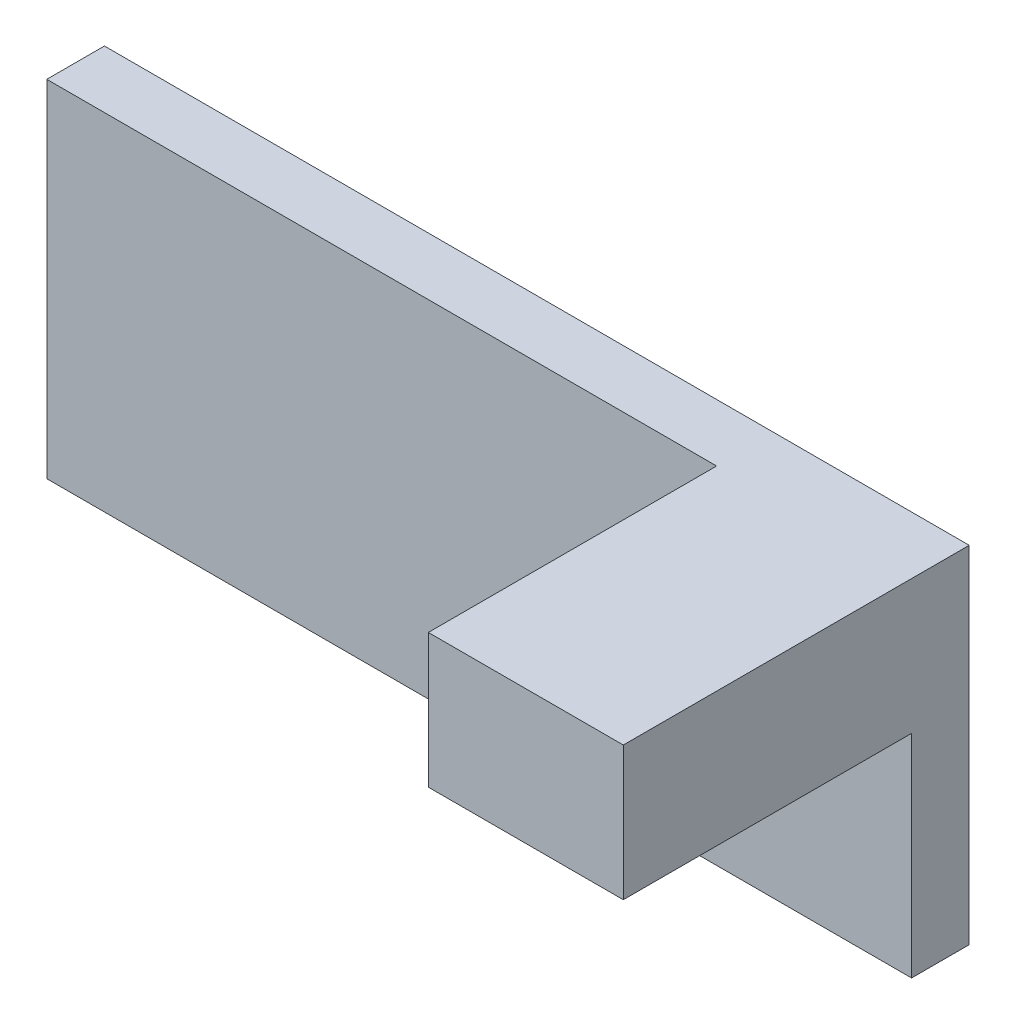
ISO-10303-21;
HEADER;
FILE_DESCRIPTION(('STEP AP214'),'2;1');
FILE_NAME('part.step','',(''),(''),'','','');
FILE_SCHEMA(('AUTOMOTIVE_DESIGN { 1 0 10303 214 1 1 1 1 }'));
ENDSEC;
DATA;
#1=APPLICATION_CONTEXT('core data for automotive mechanical design processes');
#2=APPLICATION_PROTOCOL_DEFINITION('international standard','automotive_design',2000,#1);
#3=PRODUCT_CONTEXT('',#1,'mechanical');
#4=PRODUCT('Part','Part','',(#3));
#5=PRODUCT_RELATED_PRODUCT_CATEGORY('part','',(#4));
#6=PRODUCT_DEFINITION_FORMATION('','',#4);
#7=PRODUCT_DEFINITION_CONTEXT('part definition',#1,'design');
#8=PRODUCT_DEFINITION('design','',#6,#7);
#9=PRODUCT_DEFINITION_SHAPE('','',#8);
#10=(LENGTH_UNIT() NAMED_UNIT(*) SI_UNIT(.MILLI.,.METRE.));
#11=(NAMED_UNIT(*) PLANE_ANGLE_UNIT() SI_UNIT($,.RADIAN.));
#12=(NAMED_UNIT(*) SI_UNIT($,.STERADIAN.) SOLID_ANGLE_UNIT());
#13=UNCERTAINTY_MEASURE_WITH_UNIT(LENGTH_MEASURE(1.E-05),#10,'distance_accuracy_value','');
#14=(GEOMETRIC_REPRESENTATION_CONTEXT(3) GLOBAL_UNCERTAINTY_ASSIGNED_CONTEXT((#13)) GLOBAL_UNIT_ASSIGNED_CONTEXT((#10,
#11,#12)) REPRESENTATION_CONTEXT('',''));
#15=CARTESIAN_POINT('',(0.,0.,0.));
#16=DIRECTION('',(0.,0.,1.));
#17=DIRECTION('',(1.,0.,0.));
#18=AXIS2_PLACEMENT_3D('',#15,#16,#17);
#19=CARTESIAN_POINT('',(0.,0.,10.));
#20=DIRECTION('',(0.,0.,-1.));
#21=DIRECTION('',(-1.,0.,0.));
#22=AXIS2_PLACEMENT_3D('',#19,#20,#21);
#23=PLANE('',#22);
#24=DIRECTION('',(1.,0.,0.));
#25=VECTOR('',#24,1.);
#26=CARTESIAN_POINT('',(41.1839061694207,6.75433185551872,10.));
#27=LINE('',#26,#25);
#28=CARTESIAN_POINT('',(41.1839061694207,6.75433185551872,10.));
#29=VERTEX_POINT('',#28);
#30=CARTESIAN_POINT('',(75.,6.75433185551872,10.));
#31=VERTEX_POINT('',#30);
#32=EDGE_CURVE('E121',#29,#31,#27,.T.);
#33=ORIENTED_EDGE('',*,*,#32,.F.);
#34=DIRECTION('',(0.,-1.,0.));
#35=VECTOR('',#34,1.);
#36=CARTESIAN_POINT('',(41.1839061694207,6.75433185551872,10.));
#37=LINE('',#36,#35);
#38=CARTESIAN_POINT('',(41.1839061694207,30.,10.));
#39=VERTEX_POINT('',#38);
#40=EDGE_CURVE('E57',#39,#29,#37,.T.);
#41=ORIENTED_EDGE('',*,*,#40,.F.);
#42=DIRECTION('',(-1.,0.,0.));
#43=VECTOR('',#42,1.);
#44=CARTESIAN_POINT('',(-75.,30.,10.));
#45=LINE('',#44,#43);
#46=CARTESIAN_POINT('',(-75.,30.,10.));
#47=VERTEX_POINT('',#46);
#48=EDGE_CURVE('E135',#39,#47,#45,.T.);
#49=ORIENTED_EDGE('',*,*,#48,.T.);
#50=DIRECTION('',(0.,-1.,0.));
#51=VECTOR('',#50,1.);
#52=CARTESIAN_POINT('',(-75.,-30.,10.));
#53=LINE('',#52,#51);
#54=CARTESIAN_POINT('',(-75.,-30.,10.));
#55=VERTEX_POINT('',#54);
#56=EDGE_CURVE('E138',#47,#55,#53,.T.);
#57=ORIENTED_EDGE('',*,*,#56,.T.);
#58=DIRECTION('',(1.,0.,0.));
#59=VECTOR('',#58,1.);
#60=CARTESIAN_POINT('',(-75.,-30.,10.));
#61=LINE('',#60,#59);
#62=CARTESIAN_POINT('',(75.,-30.,10.));
#63=VERTEX_POINT('',#62);
#64=EDGE_CURVE('E140',#55,#63,#61,.T.);
#65=ORIENTED_EDGE('',*,*,#64,.T.);
#66=DIRECTION('',(0.,1.,0.));
#67=VECTOR('',#66,1.);
#68=CARTESIAN_POINT('',(75.,-30.,10.));
#69=LINE('',#68,#67);
#70=EDGE_CURVE('E63',#63,#31,#69,.T.);
#71=ORIENTED_EDGE('',*,*,#70,.T.);
#72=EDGE_LOOP('',(#33,#41,#49,#57,#65,#71));
#73=FACE_BOUND('',#72,.T.);
#74=ADVANCED_FACE('F42',(#73),#23,.F.);
#75=CARTESIAN_POINT('',(75.,-30.,10.));
#76=DIRECTION('',(-1.,0.,0.));
#77=DIRECTION('',(0.,0.,1.));
#78=AXIS2_PLACEMENT_3D('',#75,#76,#77);
#79=PLANE('',#78);
#80=DIRECTION('',(0.,1.,0.));
#81=VECTOR('',#80,1.);
#82=CARTESIAN_POINT('',(75.,-30.,0.));
#83=LINE('',#82,#81);
#84=CARTESIAN_POINT('',(75.,-30.,0.));
#85=VERTEX_POINT('',#84);
#86=CARTESIAN_POINT('',(75.,30.,0.));
#87=VERTEX_POINT('',#86);
#88=EDGE_CURVE('E106',#85,#87,#83,.T.);
#89=ORIENTED_EDGE('',*,*,#88,.T.);
#90=DIRECTION('',(0.,0.,-1.));
#91=VECTOR('',#90,1.);
#92=CARTESIAN_POINT('',(75.,30.,10.));
#93=LINE('',#92,#91);
#94=CARTESIAN_POINT('',(75.,30.,60.));
#95=VERTEX_POINT('',#94);
#96=EDGE_CURVE('E11',#95,#87,#93,.T.);
#97=ORIENTED_EDGE('',*,*,#96,.F.);
#98=DIRECTION('',(0.,1.,0.));
#99=VECTOR('',#98,1.);
#100=CARTESIAN_POINT('',(75.,6.75433185551872,60.));
#101=LINE('',#100,#99);
#102=CARTESIAN_POINT('',(75.,6.75433185551872,60.));
#103=VERTEX_POINT('',#102);
#104=EDGE_CURVE('E103',#103,#95,#101,.T.);
#105=ORIENTED_EDGE('',*,*,#104,.F.);
#106=DIRECTION('',(0.,0.,-1.));
#107=VECTOR('',#106,1.);
#108=CARTESIAN_POINT('',(75.,6.75433185551872,60.));
#109=LINE('',#108,#107);
#110=EDGE_CURVE('E127',#103,#31,#109,.T.);
#111=ORIENTED_EDGE('',*,*,#110,.T.);
#112=ORIENTED_EDGE('',*,*,#70,.F.);
#113=DIRECTION('',(0.,0.,-1.));
#114=VECTOR('',#113,1.);
#115=CARTESIAN_POINT('',(75.,-30.,10.));
#116=LINE('',#115,#114);
#117=EDGE_CURVE('E142',#63,#85,#116,.T.);
#118=ORIENTED_EDGE('',*,*,#117,.T.);
#119=EDGE_LOOP('',(#89,#97,#105,#111,#112,#118));
#120=FACE_BOUND('',#119,.T.);
#121=ADVANCED_FACE('F44',(#120),#79,.F.);
#122=CARTESIAN_POINT('',(-75.,30.,10.));
#123=DIRECTION('',(0.,-1.,0.));
#124=DIRECTION('',(0.,0.,-1.));
#125=AXIS2_PLACEMENT_3D('',#122,#123,#124);
#126=PLANE('',#125);
#127=DIRECTION('',(-1.,0.,0.));
#128=VECTOR('',#127,1.);
#129=CARTESIAN_POINT('',(-75.,30.,0.));
#130=LINE('',#129,#128);
#131=CARTESIAN_POINT('',(-75.,30.,0.));
#132=VERTEX_POINT('',#131);
#133=EDGE_CURVE('E144',#87,#132,#130,.T.);
#134=ORIENTED_EDGE('',*,*,#133,.T.);
#135=DIRECTION('',(0.,0.,-1.));
#136=VECTOR('',#135,1.);
#137=CARTESIAN_POINT('',(-75.,30.,10.));
#138=LINE('',#137,#136);
#139=EDGE_CURVE('E50',#47,#132,#138,.T.);
#140=ORIENTED_EDGE('',*,*,#139,.F.);
#141=ORIENTED_EDGE('',*,*,#48,.F.);
#142=DIRECTION('',(0.,0.,-1.));
#143=VECTOR('',#142,1.);
#144=CARTESIAN_POINT('',(41.1839061694207,30.,60.));
#145=LINE('',#144,#143);
#146=CARTESIAN_POINT('',(41.1839061694207,30.,60.));
#147=VERTEX_POINT('',#146);
#148=EDGE_CURVE('E112',#147,#39,#145,.T.);
#149=ORIENTED_EDGE('',*,*,#148,.F.);
#150=DIRECTION('',(-1.,0.,0.));
#151=VECTOR('',#150,1.);
#152=CARTESIAN_POINT('',(41.1839061694207,30.,60.));
#153=LINE('',#152,#151);
#154=EDGE_CURVE('E109',#95,#147,#153,.T.);
#155=ORIENTED_EDGE('',*,*,#154,.F.);
#156=ORIENTED_EDGE('',*,*,#96,.T.);
#157=EDGE_LOOP('',(#134,#140,#141,#149,#155,#156));
#158=FACE_BOUND('',#157,.T.);
#159=ADVANCED_FACE('F110',(#158),#126,.F.);
#160=CARTESIAN_POINT('',(-75.,-30.,10.));
#161=DIRECTION('',(1.,0.,0.));
#162=DIRECTION('',(0.,0.,-1.));
#163=AXIS2_PLACEMENT_3D('',#160,#161,#162);
#164=PLANE('',#163);
#165=DIRECTION('',(0.,-1.,0.));
#166=VECTOR('',#165,1.);
#167=CARTESIAN_POINT('',(-75.,-30.,0.));
#168=LINE('',#167,#166);
#169=CARTESIAN_POINT('',(-75.,-30.,0.));
#170=VERTEX_POINT('',#169);
#171=EDGE_CURVE('E146',#132,#170,#168,.T.);
#172=ORIENTED_EDGE('',*,*,#171,.T.);
#173=DIRECTION('',(0.,0.,-1.));
#174=VECTOR('',#173,1.);
#175=CARTESIAN_POINT('',(-75.,-30.,10.));
#176=LINE('',#175,#174);
#177=EDGE_CURVE('E150',#55,#170,#176,.T.);
#178=ORIENTED_EDGE('',*,*,#177,.F.);
#179=ORIENTED_EDGE('',*,*,#56,.F.);
#180=ORIENTED_EDGE('',*,*,#139,.T.);
#181=EDGE_LOOP('',(#172,#178,#179,#180));
#182=FACE_BOUND('',#181,.T.);
#183=ADVANCED_FACE('F157',(#182),#164,.F.);
#184=CARTESIAN_POINT('',(-75.,-30.,10.));
#185=DIRECTION('',(0.,1.,0.));
#186=DIRECTION('',(0.,0.,1.));
#187=AXIS2_PLACEMENT_3D('',#184,#185,#186);
#188=PLANE('',#187);
#189=DIRECTION('',(1.,0.,0.));
#190=VECTOR('',#189,1.);
#191=CARTESIAN_POINT('',(-75.,-30.,0.));
#192=LINE('',#191,#190);
#193=EDGE_CURVE('E136',#170,#85,#192,.T.);
#194=ORIENTED_EDGE('',*,*,#193,.T.);
#195=ORIENTED_EDGE('',*,*,#117,.F.);
#196=ORIENTED_EDGE('',*,*,#64,.F.);
#197=ORIENTED_EDGE('',*,*,#177,.T.);
#198=EDGE_LOOP('',(#194,#195,#196,#197));
#199=FACE_BOUND('',#198,.T.);
#200=ADVANCED_FACE('F164',(#199),#188,.F.);
#201=CARTESIAN_POINT('',(0.,0.,0.));
#202=DIRECTION('',(0.,0.,-1.));
#203=DIRECTION('',(-1.,0.,0.));
#204=AXIS2_PLACEMENT_3D('',#201,#202,#203);
#205=PLANE('',#204);
#206=ORIENTED_EDGE('',*,*,#88,.F.);
#207=ORIENTED_EDGE('',*,*,#193,.F.);
#208=ORIENTED_EDGE('',*,*,#171,.F.);
#209=ORIENTED_EDGE('',*,*,#133,.F.);
#210=EDGE_LOOP('',(#206,#207,#208,#209));
#211=FACE_BOUND('',#210,.T.);
#212=ADVANCED_FACE('F161',(#211),#205,.T.);
#213=CARTESIAN_POINT('',(41.1839061694207,6.75433185551872,60.));
#214=DIRECTION('',(1.,0.,0.));
#215=DIRECTION('',(0.,0.,-1.));
#216=AXIS2_PLACEMENT_3D('',#213,#214,#215);
#217=PLANE('',#216);
#218=ORIENTED_EDGE('',*,*,#40,.T.);
#219=DIRECTION('',(0.,0.,-1.));
#220=VECTOR('',#219,1.);
#221=CARTESIAN_POINT('',(41.1839061694207,6.75433185551872,60.));
#222=LINE('',#221,#220);
#223=CARTESIAN_POINT('',(41.1839061694207,6.75433185551872,60.));
#224=VERTEX_POINT('',#223);
#225=EDGE_CURVE('E130',#224,#29,#222,.T.);
#226=ORIENTED_EDGE('',*,*,#225,.F.);
#227=DIRECTION('',(0.,-1.,0.));
#228=VECTOR('',#227,1.);
#229=CARTESIAN_POINT('',(41.1839061694207,6.75433185551872,60.));
#230=LINE('',#229,#228);
#231=EDGE_CURVE('E115',#147,#224,#230,.T.);
#232=ORIENTED_EDGE('',*,*,#231,.F.);
#233=ORIENTED_EDGE('',*,*,#148,.T.);
#234=EDGE_LOOP('',(#218,#226,#232,#233));
#235=FACE_BOUND('',#234,.T.);
#236=ADVANCED_FACE('F170',(#235),#217,.F.);
#237=CARTESIAN_POINT('',(41.1839061694207,6.75433185551872,60.));
#238=DIRECTION('',(0.,1.,0.));
#239=DIRECTION('',(0.,0.,1.));
#240=AXIS2_PLACEMENT_3D('',#237,#238,#239);
#241=PLANE('',#240);
#242=ORIENTED_EDGE('',*,*,#32,.T.);
#243=ORIENTED_EDGE('',*,*,#110,.F.);
#244=DIRECTION('',(1.,0.,0.));
#245=VECTOR('',#244,1.);
#246=CARTESIAN_POINT('',(41.1839061694207,6.75433185551872,60.));
#247=LINE('',#246,#245);
#248=EDGE_CURVE('E119',#224,#103,#247,.T.);
#249=ORIENTED_EDGE('',*,*,#248,.F.);
#250=ORIENTED_EDGE('',*,*,#225,.T.);
#251=EDGE_LOOP('',(#242,#243,#249,#250));
#252=FACE_BOUND('',#251,.T.);
#253=ADVANCED_FACE('F167',(#252),#241,.F.);
#254=CARTESIAN_POINT('',(0.,0.,60.));
#255=DIRECTION('',(0.,0.,-1.));
#256=DIRECTION('',(-1.,0.,0.));
#257=AXIS2_PLACEMENT_3D('',#254,#255,#256);
#258=PLANE('',#257);
#259=ORIENTED_EDGE('',*,*,#104,.T.);
#260=ORIENTED_EDGE('',*,*,#154,.T.);
#261=ORIENTED_EDGE('',*,*,#231,.T.);
#262=ORIENTED_EDGE('',*,*,#248,.T.);
#263=EDGE_LOOP('',(#259,#260,#261,#262));
#264=FACE_BOUND('',#263,.T.);
#265=ADVANCED_FACE('F117',(#264),#258,.F.);
#266=CLOSED_SHELL('',(#74,#121,#159,#183,#200,#212,#236,#253,#265));
#267=MANIFOLD_SOLID_BREP('B2',#266);
#268=ADVANCED_BREP_SHAPE_REPRESENTATION('',(#18,#267),#14);
#269=SHAPE_DEFINITION_REPRESENTATION(#9,#268);
ENDSEC;
END-ISO-10303-21;
